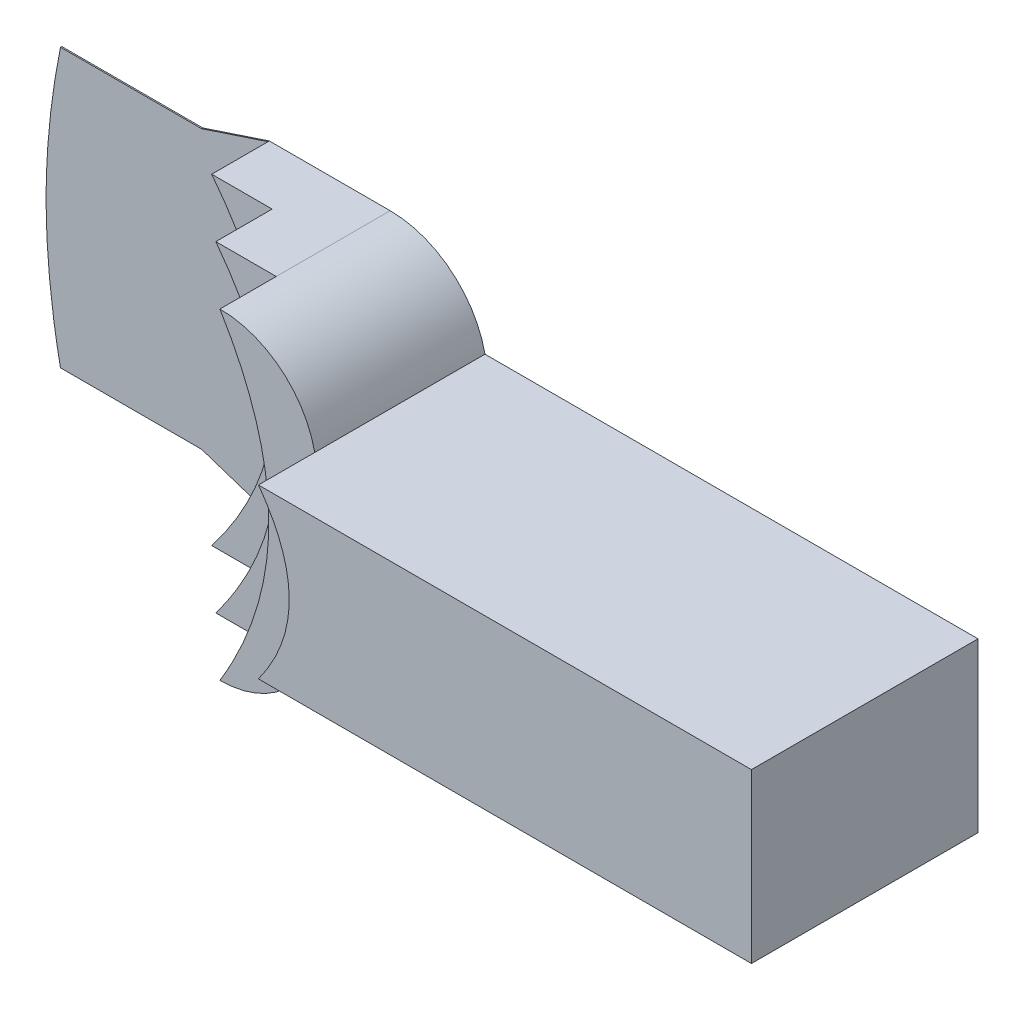
ISO-10303-21;
HEADER;
FILE_DESCRIPTION(('STEP AP214'),'2;1');
FILE_NAME('part.step','',(''),(''),'','','');
FILE_SCHEMA(('AUTOMOTIVE_DESIGN { 1 0 10303 214 1 1 1 1 }'));
ENDSEC;
DATA;
#1=APPLICATION_CONTEXT('core data for automotive mechanical design processes');
#2=APPLICATION_PROTOCOL_DEFINITION('international standard','automotive_design',2000,#1);
#3=PRODUCT_CONTEXT('',#1,'mechanical');
#4=PRODUCT('Part','Part','',(#3));
#5=PRODUCT_RELATED_PRODUCT_CATEGORY('part','',(#4));
#6=PRODUCT_DEFINITION_FORMATION('','',#4);
#7=PRODUCT_DEFINITION_CONTEXT('part definition',#1,'design');
#8=PRODUCT_DEFINITION('design','',#6,#7);
#9=PRODUCT_DEFINITION_SHAPE('','',#8);
#10=(LENGTH_UNIT() NAMED_UNIT(*) SI_UNIT(.MILLI.,.METRE.));
#11=(NAMED_UNIT(*) PLANE_ANGLE_UNIT() SI_UNIT($,.RADIAN.));
#12=(NAMED_UNIT(*) SI_UNIT($,.STERADIAN.) SOLID_ANGLE_UNIT());
#13=UNCERTAINTY_MEASURE_WITH_UNIT(LENGTH_MEASURE(1.E-05),#10,'distance_accuracy_value','');
#14=(GEOMETRIC_REPRESENTATION_CONTEXT(3) GLOBAL_UNCERTAINTY_ASSIGNED_CONTEXT((#13)) GLOBAL_UNIT_ASSIGNED_CONTEXT((#10,
#11,#12)) REPRESENTATION_CONTEXT('',''));
#15=CARTESIAN_POINT('',(0.,0.,0.));
#16=DIRECTION('',(0.,0.,1.));
#17=DIRECTION('',(1.,0.,0.));
#18=AXIS2_PLACEMENT_3D('',#15,#16,#17);
#19=CARTESIAN_POINT('',(2.22044604925031E-13,0.,1408.));
#20=CARTESIAN_POINT('',(1.98722085007794,-431.524414355501,1408.));
#21=CARTESIAN_POINT('',(89.9945121835233,-862.85076347343,1408.));
#22=B_SPLINE_CURVE_WITH_KNOTS('',2,(#19,#20,#21),.UNSPECIFIED.,.F.,.F.,(3,3),(0.,
0.488709907895311),.UNSPECIFIED.);
#23=DIRECTION('',(0.,0.,-1.));
#24=VECTOR('',#23,1.);
#25=SURFACE_OF_LINEAR_EXTRUSION('',#22,#24);
#26=CARTESIAN_POINT('',(2.22044604925031E-13,0.,8.00000000000001));
#27=CARTESIAN_POINT('',(1.98722085007794,-431.524414355501,8.00000000000001));
#28=CARTESIAN_POINT('',(89.9945121835233,-862.85076347343,8.00000000000001));
#29=B_SPLINE_CURVE_WITH_KNOTS('',2,(#26,#27,#28),.UNSPECIFIED.,.F.,.F.,(3,3),(0.,
0.488709907895311),.UNSPECIFIED.);
#30=CARTESIAN_POINT('',(0.,1.61690105748846E-09,7.9999999999999));
#31=VERTEX_POINT('',#30);
#32=CARTESIAN_POINT('',(89.9945121834758,-862.850763465357,7.9999999999999));
#33=VERTEX_POINT('',#32);
#34=EDGE_CURVE('E243',#31,#33,#29,.T.);
#35=ORIENTED_EDGE('',*,*,#34,.F.);
#36=DIRECTION('',(0.,0.,-1.));
#37=VECTOR('',#36,1.);
#38=CARTESIAN_POINT('',(2.22044604925031E-13,0.,1408.));
#39=LINE('',#38,#37);
#40=CARTESIAN_POINT('',(2.22044604925031E-13,0.,0.));
#41=VERTEX_POINT('',#40);
#42=EDGE_CURVE('E116',#31,#41,#39,.T.);
#43=ORIENTED_EDGE('',*,*,#42,.T.);
#44=CARTESIAN_POINT('',(2.22044604925031E-13,0.,0.));
#45=CARTESIAN_POINT('',(1.98722085007794,-431.524414355501,0.));
#46=CARTESIAN_POINT('',(89.9945121835233,-862.85076347343,0.));
#47=B_SPLINE_CURVE_WITH_KNOTS('',2,(#44,#45,#46),.UNSPECIFIED.,.F.,.F.,(3,3),(0.,
0.488709907895311),.UNSPECIFIED.);
#48=CARTESIAN_POINT('',(89.9945121835233,-862.85076347343,0.));
#49=VERTEX_POINT('',#48);
#50=EDGE_CURVE('E366',#41,#49,#47,.T.);
#51=ORIENTED_EDGE('',*,*,#50,.T.);
#52=DIRECTION('',(0.,0.,-1.));
#53=VECTOR('',#52,1.);
#54=CARTESIAN_POINT('',(89.9945121835233,-862.85076347343,1408.));
#55=LINE('',#54,#53);
#56=EDGE_CURVE('E51',#33,#49,#55,.T.);
#57=ORIENTED_EDGE('',*,*,#56,.F.);
#58=EDGE_LOOP('',(#35,#43,#51,#57));
#59=FACE_BOUND('',#58,.T.);
#60=ADVANCED_FACE('F42',(#59),#25,.F.);
#61=CARTESIAN_POINT('',(966.87581893019,-862.85076347343,1408.));
#62=DIRECTION('',(0.,1.,0.));
#63=DIRECTION('',(0.,0.,1.));
#64=AXIS2_PLACEMENT_3D('',#61,#62,#63);
#65=PLANE('',#64);
#66=DIRECTION('',(1.,0.,0.));
#67=VECTOR('',#66,1.);
#68=CARTESIAN_POINT('',(966.875818930145,-862.850763465357,7.9999999999999));
#69=LINE('',#68,#67);
#70=CARTESIAN_POINT('',(966.875818930145,-862.850763465357,7.9999999999999));
#71=VERTEX_POINT('',#70);
#72=EDGE_CURVE('E198',#33,#71,#69,.T.);
#73=ORIENTED_EDGE('',*,*,#72,.F.);
#74=ORIENTED_EDGE('',*,*,#56,.T.);
#75=DIRECTION('',(1.,0.,0.));
#76=VECTOR('',#75,1.);
#77=CARTESIAN_POINT('',(966.87581893019,-862.85076347343,0.));
#78=LINE('',#77,#76);
#79=CARTESIAN_POINT('',(966.87581893019,-862.85076347343,0.));
#80=VERTEX_POINT('',#79);
#81=EDGE_CURVE('E363',#49,#80,#78,.T.);
#82=ORIENTED_EDGE('',*,*,#81,.T.);
#83=DIRECTION('',(0.,0.,-1.));
#84=VECTOR('',#83,1.);
#85=CARTESIAN_POINT('',(966.87581893019,-862.85076347343,1408.));
#86=LINE('',#85,#84);
#87=EDGE_CURVE('E233',#71,#80,#86,.T.);
#88=ORIENTED_EDGE('',*,*,#87,.F.);
#89=EDGE_LOOP('',(#73,#74,#82,#88));
#90=FACE_BOUND('',#89,.T.);
#91=ADVANCED_FACE('F426',(#90),#65,.F.);
#92=CARTESIAN_POINT('',(1379.95213698434,-999.351134259754,1408.));
#93=DIRECTION('',(0.313761295711662,0.949501895371115,0.));
#94=DIRECTION('',(-0.949501895371115,0.313761295711662,0.));
#95=AXIS2_PLACEMENT_3D('',#92,#93,#94);
#96=PLANE('',#95);
#97=DIRECTION('',(0.949501895371115,-0.313761295711662,0.));
#98=VECTOR('',#97,1.);
#99=CARTESIAN_POINT('',(1379.9521369843,-999.351134251679,7.9999999999999));
#100=LINE('',#99,#98);
#101=CARTESIAN_POINT('',(1379.9521369843,-999.351134251679,7.9999999999999));
#102=VERTEX_POINT('',#101);
#103=EDGE_CURVE('E244',#71,#102,#100,.T.);
#104=ORIENTED_EDGE('',*,*,#103,.F.);
#105=ORIENTED_EDGE('',*,*,#87,.T.);
#106=DIRECTION('',(0.949501895371115,-0.313761295711662,0.));
#107=VECTOR('',#106,1.);
#108=CARTESIAN_POINT('',(1379.95213698434,-999.351134259754,0.));
#109=LINE('',#108,#107);
#110=CARTESIAN_POINT('',(1379.95213698434,-999.351134259754,0.));
#111=VERTEX_POINT('',#110);
#112=EDGE_CURVE('E360',#80,#111,#109,.T.);
#113=ORIENTED_EDGE('',*,*,#112,.T.);
#114=DIRECTION('',(0.,0.,-1.));
#115=VECTOR('',#114,1.);
#116=CARTESIAN_POINT('',(1379.95213698434,-999.351134259754,1408.));
#117=LINE('',#116,#115);
#118=EDGE_CURVE('E222',#102,#111,#117,.T.);
#119=ORIENTED_EDGE('',*,*,#118,.F.);
#120=EDGE_LOOP('',(#104,#105,#113,#119));
#121=FACE_BOUND('',#120,.T.);
#122=ADVANCED_FACE('F395',(#121),#96,.F.);
#123=CARTESIAN_POINT('',(1379.95213698434,999.351134259753,1408.));
#124=DIRECTION('',(0.313761295711662,-0.949501895371115,0.));
#125=DIRECTION('',(0.949501895371115,0.313761295711662,0.));
#126=AXIS2_PLACEMENT_3D('',#123,#124,#125);
#127=PLANE('',#126);
#128=DIRECTION('',(-0.949501895371114,-0.313761295711662,0.));
#129=VECTOR('',#128,1.);
#130=CARTESIAN_POINT('',(966.875818930143,862.850763481504,7.9999999999999));
#131=LINE('',#130,#129);
#132=CARTESIAN_POINT('',(1379.9521369843,999.351134267827,7.9999999999999));
#133=VERTEX_POINT('',#132);
#134=CARTESIAN_POINT('',(966.875818930143,862.850763481504,7.9999999999999));
#135=VERTEX_POINT('',#134);
#136=EDGE_CURVE('E179',#133,#135,#131,.T.);
#137=ORIENTED_EDGE('',*,*,#136,.F.);
#138=DIRECTION('',(0.,0.,-1.));
#139=VECTOR('',#138,1.);
#140=CARTESIAN_POINT('',(1379.95213698434,999.351134259753,1408.));
#141=LINE('',#140,#139);
#142=CARTESIAN_POINT('',(1379.95213698434,999.351134259753,0.));
#143=VERTEX_POINT('',#142);
#144=EDGE_CURVE('E204',#133,#143,#141,.T.);
#145=ORIENTED_EDGE('',*,*,#144,.T.);
#146=DIRECTION('',(-0.949501895371115,-0.313761295711662,0.));
#147=VECTOR('',#146,1.);
#148=CARTESIAN_POINT('',(1379.95213698434,999.351134259753,0.));
#149=LINE('',#148,#147);
#150=CARTESIAN_POINT('',(966.87581893019,862.85076347343,0.));
#151=VERTEX_POINT('',#150);
#152=EDGE_CURVE('E202',#143,#151,#149,.T.);
#153=ORIENTED_EDGE('',*,*,#152,.T.);
#154=DIRECTION('',(0.,0.,-1.));
#155=VECTOR('',#154,1.);
#156=CARTESIAN_POINT('',(966.87581893019,862.85076347343,1408.));
#157=LINE('',#156,#155);
#158=EDGE_CURVE('E195',#135,#151,#157,.T.);
#159=ORIENTED_EDGE('',*,*,#158,.F.);
#160=EDGE_LOOP('',(#137,#145,#153,#159));
#161=FACE_BOUND('',#160,.T.);
#162=ADVANCED_FACE('F200',(#161),#127,.F.);
#163=CARTESIAN_POINT('',(966.87581893019,862.85076347343,1408.));
#164=DIRECTION('',(0.,-1.,0.));
#165=DIRECTION('',(1.,0.,0.));
#166=AXIS2_PLACEMENT_3D('',#163,#164,#165);
#167=PLANE('',#166);
#168=DIRECTION('',(-1.,0.,0.));
#169=VECTOR('',#168,1.);
#170=CARTESIAN_POINT('',(89.9945121834758,862.850763481504,7.9999999999999));
#171=LINE('',#170,#169);
#172=CARTESIAN_POINT('',(89.9945121834758,862.850763481504,7.9999999999999));
#173=VERTEX_POINT('',#172);
#174=EDGE_CURVE('E182',#135,#173,#171,.T.);
#175=ORIENTED_EDGE('',*,*,#174,.F.);
#176=ORIENTED_EDGE('',*,*,#158,.T.);
#177=DIRECTION('',(-1.,0.,0.));
#178=VECTOR('',#177,1.);
#179=CARTESIAN_POINT('',(966.87581893019,862.85076347343,0.));
#180=LINE('',#179,#178);
#181=CARTESIAN_POINT('',(89.9945121835233,862.85076347343,0.));
#182=VERTEX_POINT('',#181);
#183=EDGE_CURVE('E335',#151,#182,#180,.T.);
#184=ORIENTED_EDGE('',*,*,#183,.T.);
#185=DIRECTION('',(0.,0.,-1.));
#186=VECTOR('',#185,1.);
#187=CARTESIAN_POINT('',(89.9945121835233,862.85076347343,1408.));
#188=LINE('',#187,#186);
#189=EDGE_CURVE('E197',#173,#182,#188,.T.);
#190=ORIENTED_EDGE('',*,*,#189,.F.);
#191=EDGE_LOOP('',(#175,#176,#184,#190));
#192=FACE_BOUND('',#191,.T.);
#193=ADVANCED_FACE('F193',(#192),#167,.F.);
#194=CARTESIAN_POINT('',(89.9945121835233,862.85076347343,1408.));
#195=CARTESIAN_POINT('',(1.98722085007789,431.524414355501,1408.));
#196=CARTESIAN_POINT('',(2.22044604925031E-13,0.,1408.));
#197=B_SPLINE_CURVE_WITH_KNOTS('',2,(#194,#195,#196),.UNSPECIFIED.,.F.,.F.,(3,3),(0.,
0.488709907895311),.UNSPECIFIED.);
#198=DIRECTION('',(0.,0.,-1.));
#199=VECTOR('',#198,1.);
#200=SURFACE_OF_LINEAR_EXTRUSION('',#197,#199);
#201=CARTESIAN_POINT('',(89.9945121835233,862.85076347343,8.00000000000001));
#202=CARTESIAN_POINT('',(1.98722085007789,431.524414355501,8.00000000000001));
#203=CARTESIAN_POINT('',(2.22044604925031E-13,0.,8.00000000000001));
#204=B_SPLINE_CURVE_WITH_KNOTS('',2,(#201,#202,#203),.UNSPECIFIED.,.F.,.F.,(3,3),(0.,
0.488709907895311),.UNSPECIFIED.);
#205=EDGE_CURVE('E11',#173,#31,#204,.T.);
#206=ORIENTED_EDGE('',*,*,#205,.F.);
#207=ORIENTED_EDGE('',*,*,#189,.T.);
#208=CARTESIAN_POINT('',(89.9945121835233,862.85076347343,0.));
#209=CARTESIAN_POINT('',(1.98722085007789,431.524414355501,0.));
#210=CARTESIAN_POINT('',(2.22044604925031E-13,0.,0.));
#211=B_SPLINE_CURVE_WITH_KNOTS('',2,(#208,#209,#210),.UNSPECIFIED.,.F.,.F.,(3,3),(0.,
0.488709907895311),.UNSPECIFIED.);
#212=EDGE_CURVE('E330',#182,#41,#211,.T.);
#213=ORIENTED_EDGE('',*,*,#212,.T.);
#214=ORIENTED_EDGE('',*,*,#42,.F.);
#215=EDGE_LOOP('',(#206,#207,#213,#214));
#216=FACE_BOUND('',#215,.T.);
#217=ADVANCED_FACE('F383',(#216),#200,.F.);
#218=CARTESIAN_POINT('',(1379.95213698434,-999.351134259754,1408.));
#219=DIRECTION('',(0.,1.,0.));
#220=DIRECTION('',(0.,0.,1.));
#221=AXIS2_PLACEMENT_3D('',#218,#219,#220);
#222=PLANE('',#221);
#223=DIRECTION('',(0.,0.,1.));
#224=VECTOR('',#223,1.);
#225=CARTESIAN_POINT('',(1755.40525859012,-999.351134251679,358.));
#226=LINE('',#225,#224);
#227=CARTESIAN_POINT('',(1755.40525859012,-999.351134251679,358.));
#228=VERTEX_POINT('',#227);
#229=CARTESIAN_POINT('',(1755.40525859012,-999.351134251679,708.));
#230=VERTEX_POINT('',#229);
#231=EDGE_CURVE('E59',#228,#230,#226,.T.);
#232=ORIENTED_EDGE('',*,*,#231,.F.);
#233=DIRECTION('',(1.,0.,0.));
#234=VECTOR('',#233,1.);
#235=CARTESIAN_POINT('',(0.,-999.351134251679,358.));
#236=LINE('',#235,#234);
#237=CARTESIAN_POINT('',(1379.9521369843,-999.351134251679,358.));
#238=VERTEX_POINT('',#237);
#239=EDGE_CURVE('E285',#238,#228,#236,.T.);
#240=ORIENTED_EDGE('',*,*,#239,.F.);
#241=EDGE_CURVE('E225',#238,#102,#117,.T.);
#242=ORIENTED_EDGE('',*,*,#241,.T.);
#243=ORIENTED_EDGE('',*,*,#118,.T.);
#244=DIRECTION('',(1.,0.,0.));
#245=VECTOR('',#244,1.);
#246=CARTESIAN_POINT('',(1379.95213698434,-999.351134259754,0.));
#247=LINE('',#246,#245);
#248=CARTESIAN_POINT('',(2130.85838019589,-999.351134259753,0.));
#249=VERTEX_POINT('',#248);
#250=EDGE_CURVE('E357',#111,#249,#247,.T.);
#251=ORIENTED_EDGE('',*,*,#250,.T.);
#252=DIRECTION('',(0.,0.,-1.));
#253=VECTOR('',#252,1.);
#254=CARTESIAN_POINT('',(2130.85838019589,-999.351134259753,1408.));
#255=LINE('',#254,#253);
#256=CARTESIAN_POINT('',(2130.85838019584,-999.351134251679,708.));
#257=VERTEX_POINT('',#256);
#258=EDGE_CURVE('E485',#257,#249,#255,.T.);
#259=ORIENTED_EDGE('',*,*,#258,.F.);
#260=DIRECTION('',(1.,0.,0.));
#261=VECTOR('',#260,1.);
#262=CARTESIAN_POINT('',(0.,-999.351134251679,708.));
#263=LINE('',#262,#261);
#264=EDGE_CURVE('E320',#230,#257,#263,.T.);
#265=ORIENTED_EDGE('',*,*,#264,.F.);
#266=EDGE_LOOP('',(#232,#240,#242,#243,#251,#259,#265));
#267=FACE_BOUND('',#266,.T.);
#268=ADVANCED_FACE('F387',(#267),#222,.F.);
#269=CARTESIAN_POINT('',(1379.95213698434,999.351134259753,1408.));
#270=DIRECTION('',(0.,-1.,0.));
#271=DIRECTION('',(0.,0.,-1.));
#272=AXIS2_PLACEMENT_3D('',#269,#270,#271);
#273=PLANE('',#272);
#274=DIRECTION('',(0.,0.,1.));
#275=VECTOR('',#274,1.);
#276=CARTESIAN_POINT('',(1755.40525858926,999.351134267827,358.));
#277=LINE('',#276,#275);
#278=CARTESIAN_POINT('',(1755.40525858926,999.351134267827,358.));
#279=VERTEX_POINT('',#278);
#280=CARTESIAN_POINT('',(1755.40525858926,999.351134267827,708.));
#281=VERTEX_POINT('',#280);
#282=EDGE_CURVE('E288',#279,#281,#277,.T.);
#283=ORIENTED_EDGE('',*,*,#282,.T.);
#284=DIRECTION('',(-1.,0.,0.));
#285=VECTOR('',#284,1.);
#286=CARTESIAN_POINT('',(0.,999.351134267827,708.));
#287=LINE('',#286,#285);
#288=CARTESIAN_POINT('',(2130.85838019584,999.351134267827,708.));
#289=VERTEX_POINT('',#288);
#290=EDGE_CURVE('E316',#289,#281,#287,.T.);
#291=ORIENTED_EDGE('',*,*,#290,.F.);
#292=DIRECTION('',(0.,0.,-1.));
#293=VECTOR('',#292,1.);
#294=CARTESIAN_POINT('',(2130.85838019589,999.351134259753,1408.));
#295=LINE('',#294,#293);
#296=CARTESIAN_POINT('',(2130.85838019589,999.351134259753,0.));
#297=VERTEX_POINT('',#296);
#298=EDGE_CURVE('E221',#289,#297,#295,.T.);
#299=ORIENTED_EDGE('',*,*,#298,.T.);
#300=DIRECTION('',(-1.,0.,0.));
#301=VECTOR('',#300,1.);
#302=CARTESIAN_POINT('',(1379.95213698434,999.351134259753,0.));
#303=LINE('',#302,#301);
#304=EDGE_CURVE('E341',#297,#143,#303,.T.);
#305=ORIENTED_EDGE('',*,*,#304,.T.);
#306=ORIENTED_EDGE('',*,*,#144,.F.);
#307=CARTESIAN_POINT('',(1379.9521369843,999.351134267827,358.));
#308=VERTEX_POINT('',#307);
#309=EDGE_CURVE('E206',#308,#133,#141,.T.);
#310=ORIENTED_EDGE('',*,*,#309,.F.);
#311=DIRECTION('',(-1.,0.,0.));
#312=VECTOR('',#311,1.);
#313=CARTESIAN_POINT('',(0.,999.351134267827,358.));
#314=LINE('',#313,#312);
#315=EDGE_CURVE('E278',#279,#308,#314,.T.);
#316=ORIENTED_EDGE('',*,*,#315,.F.);
#317=EDGE_LOOP('',(#283,#291,#299,#305,#306,#310,#316));
#318=FACE_BOUND('',#317,.T.);
#319=ADVANCED_FACE('F396',(#318),#273,.F.);
#320=CARTESIAN_POINT('',(0.,0.,708.));
#321=DIRECTION('',(0.,0.,1.));
#322=DIRECTION('',(1.,0.,0.));
#323=AXIS2_PLACEMENT_3D('',#320,#321,#322);
#324=PLANE('',#323);
#325=ORIENTED_EDGE('',*,*,#290,.T.);
#326=CARTESIAN_POINT('',(1755.40525858926,999.351134267827,708.));
#327=CARTESIAN_POINT('',(2506.31150180209,3.31995910797522E-09,708.));
#328=CARTESIAN_POINT('',(1755.40525859012,-999.351134259753,708.));
#329=B_SPLINE_CURVE_WITH_KNOTS('',2,(#326,#327,#328),.UNSPECIFIED.,.F.,.F.,(3,3),(0.,1.),.UNSPECIFIED.);
#330=EDGE_CURVE('E279',#281,#230,#329,.T.);
#331=ORIENTED_EDGE('',*,*,#330,.T.);
#332=ORIENTED_EDGE('',*,*,#264,.T.);
#333=CARTESIAN_POINT('',(2130.85838019589,999.351134259753,708.));
#334=CARTESIAN_POINT('',(2738.48391057864,0.,708.));
#335=CARTESIAN_POINT('',(2130.85838019589,-999.351134259753,708.));
#336=B_SPLINE_CURVE_WITH_KNOTS('',2,(#333,#334,#335),.UNSPECIFIED.,.F.,.F.,(3,3),(0.,1.),.UNSPECIFIED.);
#337=EDGE_CURVE('E312',#289,#257,#336,.T.);
#338=ORIENTED_EDGE('',*,*,#337,.F.);
#339=EDGE_LOOP('',(#325,#331,#332,#338));
#340=FACE_BOUND('',#339,.T.);
#341=ADVANCED_FACE('F271',(#340),#324,.T.);
#342=CARTESIAN_POINT('',(2130.85838019584,396.960085386174,1058.));
#343=DIRECTION('',(0.,0.,1.));
#344=DIRECTION('',(1.,0.,0.));
#345=AXIS2_PLACEMENT_3D('',#342,#343,#344);
#346=PLANE('',#345);
#347=CARTESIAN_POINT('',(2130.85838019584,396.960085386174,1058.));
#348=DIRECTION('',(0.,0.,1.));
#349=DIRECTION('',(1.,0.,0.));
#350=AXIS2_PLACEMENT_3D('',#347,#348,#349);
#351=CIRCLE('',#350,602.391048881653);
#352=CARTESIAN_POINT('',(2720.16351545077,521.837758870685,1058.));
#353=VERTEX_POINT('',#352);
#354=CARTESIAN_POINT('',(2130.85838019584,999.351134267827,1058.));
#355=VERTEX_POINT('',#354);
#356=EDGE_CURVE('E470',#353,#355,#351,.T.);
#357=ORIENTED_EDGE('',*,*,#356,.T.);
#358=CARTESIAN_POINT('',(2130.85838019589,999.351134259753,1058.));
#359=CARTESIAN_POINT('',(2738.48391057864,0.,1058.));
#360=CARTESIAN_POINT('',(2130.85838019589,-999.351134259753,1058.));
#361=B_SPLINE_CURVE_WITH_KNOTS('',2,(#358,#359,#360),.UNSPECIFIED.,.F.,.F.,(3,3),(0.,1.),.UNSPECIFIED.);
#362=CARTESIAN_POINT('',(2130.85838019584,-999.351134251679,1058.));
#363=VERTEX_POINT('',#362);
#364=EDGE_CURVE('E296',#355,#363,#361,.T.);
#365=ORIENTED_EDGE('',*,*,#364,.T.);
#366=CARTESIAN_POINT('',(2130.85838019584,-396.960085370026,1058.));
#367=DIRECTION('',(0.,0.,1.));
#368=DIRECTION('',(1.,0.,0.));
#369=AXIS2_PLACEMENT_3D('',#366,#367,#368);
#370=CIRCLE('',#369,602.391048881653);
#371=CARTESIAN_POINT('',(2720.16351545077,-521.837758854537,1058.));
#372=VERTEX_POINT('',#371);
#373=EDGE_CURVE('E370',#363,#372,#370,.T.);
#374=ORIENTED_EDGE('',*,*,#373,.T.);
#375=CARTESIAN_POINT('',(2720.16351545077,-521.837758854537,1058.));
#376=CARTESIAN_POINT('',(3102.62843613403,8.07385104953373E-09,1058.));
#377=CARTESIAN_POINT('',(2720.16351545077,521.837758870685,1058.));
#378=B_SPLINE_CURVE_WITH_KNOTS('',2,(#375,#376,#377),.UNSPECIFIED.,.F.,.F.,(3,3),(0.,1.),.UNSPECIFIED.);
#379=EDGE_CURVE('E499',#372,#353,#378,.T.);
#380=ORIENTED_EDGE('',*,*,#379,.T.);
#381=EDGE_LOOP('',(#357,#365,#374,#380));
#382=FACE_BOUND('',#381,.T.);
#383=ADVANCED_FACE('F420',(#382),#346,.T.);
#384=CARTESIAN_POINT('',(2130.85838019589,-396.9600853781,1408.));
#385=DIRECTION('',(0.,0.,-1.));
#386=DIRECTION('',(-1.,0.,0.));
#387=AXIS2_PLACEMENT_3D('',#384,#385,#386);
#388=CYLINDRICAL_SURFACE('',#387,602.391048881653);
#389=ORIENTED_EDGE('',*,*,#373,.F.);
#390=EDGE_CURVE('E226',#363,#257,#255,.T.);
#391=ORIENTED_EDGE('',*,*,#390,.T.);
#392=ORIENTED_EDGE('',*,*,#258,.T.);
#393=CARTESIAN_POINT('',(2130.85838019589,-396.9600853781,0.));
#394=DIRECTION('',(0.,0.,1.));
#395=DIRECTION('',(1.,0.,0.));
#396=AXIS2_PLACEMENT_3D('',#393,#394,#395);
#397=CIRCLE('',#396,602.391048881653);
#398=CARTESIAN_POINT('',(2720.16351545082,-521.837758862611,0.));
#399=VERTEX_POINT('',#398);
#400=EDGE_CURVE('E354',#249,#399,#397,.T.);
#401=ORIENTED_EDGE('',*,*,#400,.T.);
#402=DIRECTION('',(0.,0.,-1.));
#403=VECTOR('',#402,1.);
#404=CARTESIAN_POINT('',(2720.16351545082,-521.837758862611,1408.));
#405=LINE('',#404,#403);
#406=EDGE_CURVE('E482',#372,#399,#405,.T.);
#407=ORIENTED_EDGE('',*,*,#406,.F.);
#408=EDGE_LOOP('',(#389,#391,#392,#401,#407));
#409=FACE_BOUND('',#408,.T.);
#410=ADVANCED_FACE('F404',(#409),#388,.T.);
#411=CARTESIAN_POINT('',(2130.85838019589,396.9600853781,1408.));
#412=DIRECTION('',(0.,0.,-1.));
#413=DIRECTION('',(-1.,0.,0.));
#414=AXIS2_PLACEMENT_3D('',#411,#412,#413);
#415=CYLINDRICAL_SURFACE('',#414,602.391048881653);
#416=ORIENTED_EDGE('',*,*,#356,.F.);
#417=DIRECTION('',(0.,0.,-1.));
#418=VECTOR('',#417,1.);
#419=CARTESIAN_POINT('',(2720.16351545082,521.837758862611,1408.));
#420=LINE('',#419,#418);
#421=CARTESIAN_POINT('',(2720.16351545082,521.837758862611,0.));
#422=VERTEX_POINT('',#421);
#423=EDGE_CURVE('E468',#353,#422,#420,.T.);
#424=ORIENTED_EDGE('',*,*,#423,.T.);
#425=CARTESIAN_POINT('',(2130.85838019589,396.9600853781,0.));
#426=DIRECTION('',(0.,0.,1.));
#427=DIRECTION('',(-1.,0.,0.));
#428=AXIS2_PLACEMENT_3D('',#425,#426,#427);
#429=CIRCLE('',#428,602.391048881653);
#430=EDGE_CURVE('E344',#422,#297,#429,.T.);
#431=ORIENTED_EDGE('',*,*,#430,.T.);
#432=ORIENTED_EDGE('',*,*,#298,.F.);
#433=EDGE_CURVE('E465',#355,#289,#295,.T.);
#434=ORIENTED_EDGE('',*,*,#433,.F.);
#435=EDGE_LOOP('',(#416,#424,#431,#432,#434));
#436=FACE_BOUND('',#435,.T.);
#437=ADVANCED_FACE('F400',(#436),#415,.T.);
#438=CARTESIAN_POINT('',(2720.16351545082,-521.837758862611,1408.));
#439=DIRECTION('',(0.,1.,0.));
#440=DIRECTION('',(0.,0.,1.));
#441=AXIS2_PLACEMENT_3D('',#438,#439,#440);
#442=PLANE('',#441);
#443=DIRECTION('',(1.,0.,0.));
#444=VECTOR('',#443,1.);
#445=CARTESIAN_POINT('',(2720.16351545082,-521.837758862611,0.));
#446=LINE('',#445,#444);
#447=CARTESIAN_POINT('',(5784.16351545082,-521.837758862611,0.));
#448=VERTEX_POINT('',#447);
#449=EDGE_CURVE('E352',#399,#448,#446,.T.);
#450=ORIENTED_EDGE('',*,*,#449,.T.);
#451=DIRECTION('',(0.,0.,-1.));
#452=VECTOR('',#451,1.);
#453=CARTESIAN_POINT('',(5784.16351545082,-521.837758862611,1408.));
#454=LINE('',#453,#452);
#455=CARTESIAN_POINT('',(5784.16351545082,-521.837758862611,1408.));
#456=VERTEX_POINT('',#455);
#457=EDGE_CURVE('E480',#456,#448,#454,.T.);
#458=ORIENTED_EDGE('',*,*,#457,.F.);
#459=DIRECTION('',(1.,0.,0.));
#460=VECTOR('',#459,1.);
#461=CARTESIAN_POINT('',(2720.16351545082,-521.837758862611,1408.));
#462=LINE('',#461,#460);
#463=CARTESIAN_POINT('',(2720.16351545082,-521.837758862611,1408.));
#464=VERTEX_POINT('',#463);
#465=EDGE_CURVE('E334',#464,#456,#462,.T.);
#466=ORIENTED_EDGE('',*,*,#465,.F.);
#467=EDGE_CURVE('E123',#464,#372,#405,.T.);
#468=ORIENTED_EDGE('',*,*,#467,.T.);
#469=ORIENTED_EDGE('',*,*,#406,.T.);
#470=EDGE_LOOP('',(#450,#458,#466,#468,#469));
#471=FACE_BOUND('',#470,.T.);
#472=ADVANCED_FACE('F403',(#471),#442,.F.);
#473=CARTESIAN_POINT('',(5784.16351545082,521.837758862611,1408.));
#474=DIRECTION('',(-1.,0.,0.));
#475=DIRECTION('',(0.,0.,1.));
#476=AXIS2_PLACEMENT_3D('',#473,#474,#475);
#477=PLANE('',#476);
#478=DIRECTION('',(0.,1.,0.));
#479=VECTOR('',#478,1.);
#480=CARTESIAN_POINT('',(5784.16351545082,521.837758862611,0.));
#481=LINE('',#480,#479);
#482=CARTESIAN_POINT('',(5784.16351545082,521.837758862611,0.));
#483=VERTEX_POINT('',#482);
#484=EDGE_CURVE('E350',#448,#483,#481,.T.);
#485=ORIENTED_EDGE('',*,*,#484,.T.);
#486=DIRECTION('',(0.,0.,-1.));
#487=VECTOR('',#486,1.);
#488=CARTESIAN_POINT('',(5784.16351545082,521.837758862611,1408.));
#489=LINE('',#488,#487);
#490=CARTESIAN_POINT('',(5784.16351545082,521.837758862611,1408.));
#491=VERTEX_POINT('',#490);
#492=EDGE_CURVE('E475',#491,#483,#489,.T.);
#493=ORIENTED_EDGE('',*,*,#492,.F.);
#494=DIRECTION('',(0.,1.,0.));
#495=VECTOR('',#494,1.);
#496=CARTESIAN_POINT('',(5784.16351545082,521.837758862611,1408.));
#497=LINE('',#496,#495);
#498=EDGE_CURVE('E68',#456,#491,#497,.T.);
#499=ORIENTED_EDGE('',*,*,#498,.F.);
#500=ORIENTED_EDGE('',*,*,#457,.T.);
#501=EDGE_LOOP('',(#485,#493,#499,#500));
#502=FACE_BOUND('',#501,.T.);
#503=ADVANCED_FACE('F410',(#502),#477,.F.);
#504=CARTESIAN_POINT('',(2720.16351545082,521.837758862611,1408.));
#505=DIRECTION('',(0.,-1.,0.));
#506=DIRECTION('',(0.,0.,-1.));
#507=AXIS2_PLACEMENT_3D('',#504,#505,#506);
#508=PLANE('',#507);
#509=DIRECTION('',(-1.,0.,0.));
#510=VECTOR('',#509,1.);
#511=CARTESIAN_POINT('',(2720.16351545082,521.837758862611,0.));
#512=LINE('',#511,#510);
#513=EDGE_CURVE('E347',#483,#422,#512,.T.);
#514=ORIENTED_EDGE('',*,*,#513,.T.);
#515=ORIENTED_EDGE('',*,*,#423,.F.);
#516=CARTESIAN_POINT('',(2720.16351545077,521.837758870685,1408.));
#517=VERTEX_POINT('',#516);
#518=EDGE_CURVE('E472',#517,#353,#420,.T.);
#519=ORIENTED_EDGE('',*,*,#518,.F.);
#520=DIRECTION('',(-1.,0.,0.));
#521=VECTOR('',#520,1.);
#522=CARTESIAN_POINT('',(2720.16351545082,521.837758862611,1408.));
#523=LINE('',#522,#521);
#524=EDGE_CURVE('E327',#491,#517,#523,.T.);
#525=ORIENTED_EDGE('',*,*,#524,.F.);
#526=ORIENTED_EDGE('',*,*,#492,.T.);
#527=EDGE_LOOP('',(#514,#515,#519,#525,#526));
#528=FACE_BOUND('',#527,.T.);
#529=ADVANCED_FACE('F406',(#528),#508,.F.);
#530=CARTESIAN_POINT('',(23.4922384709198,-431.474898046108,1408.));
#531=DIRECTION('',(0.,0.,1.));
#532=DIRECTION('',(1.,0.,0.));
#533=AXIS2_PLACEMENT_3D('',#530,#531,#532);
#534=PLANE('',#533);
#535=CARTESIAN_POINT('',(2720.16351545077,-521.837758854537,1408.));
#536=CARTESIAN_POINT('',(3102.62843613403,8.07385104953373E-09,1408.));
#537=CARTESIAN_POINT('',(2720.16351545077,521.837758870685,1408.));
#538=B_SPLINE_CURVE_WITH_KNOTS('',2,(#535,#536,#537),.UNSPECIFIED.,.F.,.F.,(3,3),(0.,1.),.UNSPECIFIED.);
#539=EDGE_CURVE('E325',#464,#517,#538,.T.);
#540=ORIENTED_EDGE('',*,*,#539,.F.);
#541=ORIENTED_EDGE('',*,*,#465,.T.);
#542=ORIENTED_EDGE('',*,*,#498,.T.);
#543=ORIENTED_EDGE('',*,*,#524,.T.);
#544=EDGE_LOOP('',(#540,#541,#542,#543));
#545=FACE_BOUND('',#544,.T.);
#546=ADVANCED_FACE('F409',(#545),#534,.T.);
#547=CARTESIAN_POINT('',(23.4922384709198,-431.474898046108,0.));
#548=DIRECTION('',(0.,0.,1.));
#549=DIRECTION('',(1.,0.,0.));
#550=AXIS2_PLACEMENT_3D('',#547,#548,#549);
#551=PLANE('',#550);
#552=ORIENTED_EDGE('',*,*,#50,.F.);
#553=ORIENTED_EDGE('',*,*,#212,.F.);
#554=ORIENTED_EDGE('',*,*,#183,.F.);
#555=ORIENTED_EDGE('',*,*,#152,.F.);
#556=ORIENTED_EDGE('',*,*,#304,.F.);
#557=ORIENTED_EDGE('',*,*,#430,.F.);
#558=ORIENTED_EDGE('',*,*,#513,.F.);
#559=ORIENTED_EDGE('',*,*,#484,.F.);
#560=ORIENTED_EDGE('',*,*,#449,.F.);
#561=ORIENTED_EDGE('',*,*,#400,.F.);
#562=ORIENTED_EDGE('',*,*,#250,.F.);
#563=ORIENTED_EDGE('',*,*,#112,.F.);
#564=ORIENTED_EDGE('',*,*,#81,.F.);
#565=EDGE_LOOP('',(#552,#553,#554,#555,#556,#557,#558,#559,#560,#561,#562,#563,#564));
#566=FACE_BOUND('',#565,.T.);
#567=ADVANCED_FACE('F389',(#566),#551,.F.);
#568=DIRECTION('',(0.,0.,1.));
#569=VECTOR('',#568,1.);
#570=SURFACE_OF_LINEAR_EXTRUSION('',#378,#569);
#571=ORIENTED_EDGE('',*,*,#539,.T.);
#572=ORIENTED_EDGE('',*,*,#518,.T.);
#573=ORIENTED_EDGE('',*,*,#379,.F.);
#574=ORIENTED_EDGE('',*,*,#467,.F.);
#575=EDGE_LOOP('',(#571,#572,#573,#574));
#576=FACE_BOUND('',#575,.T.);
#577=ADVANCED_FACE('F510',(#576),#570,.F.);
#578=DIRECTION('',(0.,0.,1.));
#579=VECTOR('',#578,1.);
#580=SURFACE_OF_LINEAR_EXTRUSION('',#336,#579);
#581=ORIENTED_EDGE('',*,*,#364,.F.);
#582=ORIENTED_EDGE('',*,*,#433,.T.);
#583=ORIENTED_EDGE('',*,*,#337,.T.);
#584=ORIENTED_EDGE('',*,*,#390,.F.);
#585=EDGE_LOOP('',(#581,#582,#583,#584));
#586=FACE_BOUND('',#585,.T.);
#587=ADVANCED_FACE('F270',(#586),#580,.T.);
#588=CARTESIAN_POINT('',(1755.40525858926,999.351134267827,358.));
#589=CARTESIAN_POINT('',(2506.31150180209,3.31995910797522E-09,358.));
#590=CARTESIAN_POINT('',(1755.40525859012,-999.351134259753,358.));
#591=B_SPLINE_CURVE_WITH_KNOTS('',2,(#588,#589,#590),.UNSPECIFIED.,.F.,.F.,(3,3),(0.,1.),.UNSPECIFIED.);
#592=DIRECTION('',(0.,0.,1.));
#593=VECTOR('',#592,1.);
#594=SURFACE_OF_LINEAR_EXTRUSION('',#591,#593);
#595=ORIENTED_EDGE('',*,*,#330,.F.);
#596=ORIENTED_EDGE('',*,*,#282,.F.);
#597=EDGE_CURVE('E273',#279,#228,#591,.T.);
#598=ORIENTED_EDGE('',*,*,#597,.T.);
#599=ORIENTED_EDGE('',*,*,#231,.T.);
#600=EDGE_LOOP('',(#595,#596,#598,#599));
#601=FACE_BOUND('',#600,.T.);
#602=ADVANCED_FACE('F266',(#601),#594,.T.);
#603=CARTESIAN_POINT('',(0.,0.,358.));
#604=DIRECTION('',(0.,0.,1.));
#605=DIRECTION('',(1.,0.,0.));
#606=AXIS2_PLACEMENT_3D('',#603,#604,#605);
#607=PLANE('',#606);
#608=CARTESIAN_POINT('',(1379.9521369843,-999.351134251679,358.));
#609=CARTESIAN_POINT('',(2157.53326667294,5.95100314512709E-09,358.));
#610=CARTESIAN_POINT('',(1379.9521369843,999.351134267827,358.));
#611=B_SPLINE_CURVE_WITH_KNOTS('',2,(#608,#609,#610),.UNSPECIFIED.,.F.,.F.,(3,3),(0.,1.),.UNSPECIFIED.);
#612=EDGE_CURVE('E189',#238,#308,#611,.T.);
#613=ORIENTED_EDGE('',*,*,#612,.F.);
#614=ORIENTED_EDGE('',*,*,#239,.T.);
#615=ORIENTED_EDGE('',*,*,#597,.F.);
#616=ORIENTED_EDGE('',*,*,#315,.T.);
#617=EDGE_LOOP('',(#613,#614,#615,#616));
#618=FACE_BOUND('',#617,.T.);
#619=ADVANCED_FACE('F263',(#618),#607,.T.);
#620=CARTESIAN_POINT('',(1768.74270182862,7.01250169043988E-09,7.9999999999999));
#621=DIRECTION('',(0.,0.,1.));
#622=DIRECTION('',(1.,0.,0.));
#623=AXIS2_PLACEMENT_3D('',#620,#621,#622);
#624=PLANE('',#623);
#625=ORIENTED_EDGE('',*,*,#34,.T.);
#626=ORIENTED_EDGE('',*,*,#72,.T.);
#627=ORIENTED_EDGE('',*,*,#103,.T.);
#628=CARTESIAN_POINT('',(1379.9521369843,-999.351134251679,7.9999999999999));
#629=CARTESIAN_POINT('',(2157.53326667294,5.95100314512709E-09,7.9999999999999));
#630=CARTESIAN_POINT('',(1379.9521369843,999.351134267827,7.9999999999999));
#631=B_SPLINE_CURVE_WITH_KNOTS('',2,(#628,#629,#630),.UNSPECIFIED.,.F.,.F.,(3,3),(0.,1.),.UNSPECIFIED.);
#632=EDGE_CURVE('E185',#102,#133,#631,.T.);
#633=ORIENTED_EDGE('',*,*,#632,.T.);
#634=ORIENTED_EDGE('',*,*,#136,.T.);
#635=ORIENTED_EDGE('',*,*,#174,.T.);
#636=ORIENTED_EDGE('',*,*,#205,.T.);
#637=EDGE_LOOP('',(#625,#626,#627,#633,#634,#635,#636));
#638=FACE_BOUND('',#637,.T.);
#639=ADVANCED_FACE('F181',(#638),#624,.T.);
#640=DIRECTION('',(0.,0.,1.));
#641=VECTOR('',#640,1.);
#642=SURFACE_OF_LINEAR_EXTRUSION('',#631,#641);
#643=ORIENTED_EDGE('',*,*,#612,.T.);
#644=ORIENTED_EDGE('',*,*,#309,.T.);
#645=ORIENTED_EDGE('',*,*,#632,.F.);
#646=ORIENTED_EDGE('',*,*,#241,.F.);
#647=EDGE_LOOP('',(#643,#644,#645,#646));
#648=FACE_BOUND('',#647,.T.);
#649=ADVANCED_FACE('F258',(#648),#642,.F.);
#650=CLOSED_SHELL('',(#60,#91,#122,#162,#193,#217,#268,#319,#341,#383,#410,#437,#472,#503,#529,
#546,#567,#577,#587,#602,#619,#639,#649));
#651=MANIFOLD_SOLID_BREP('B2',#650);
#652=ADVANCED_BREP_SHAPE_REPRESENTATION('',(#18,#651),#14);
#653=SHAPE_DEFINITION_REPRESENTATION(#9,#652);
ENDSEC;
END-ISO-10303-21;
